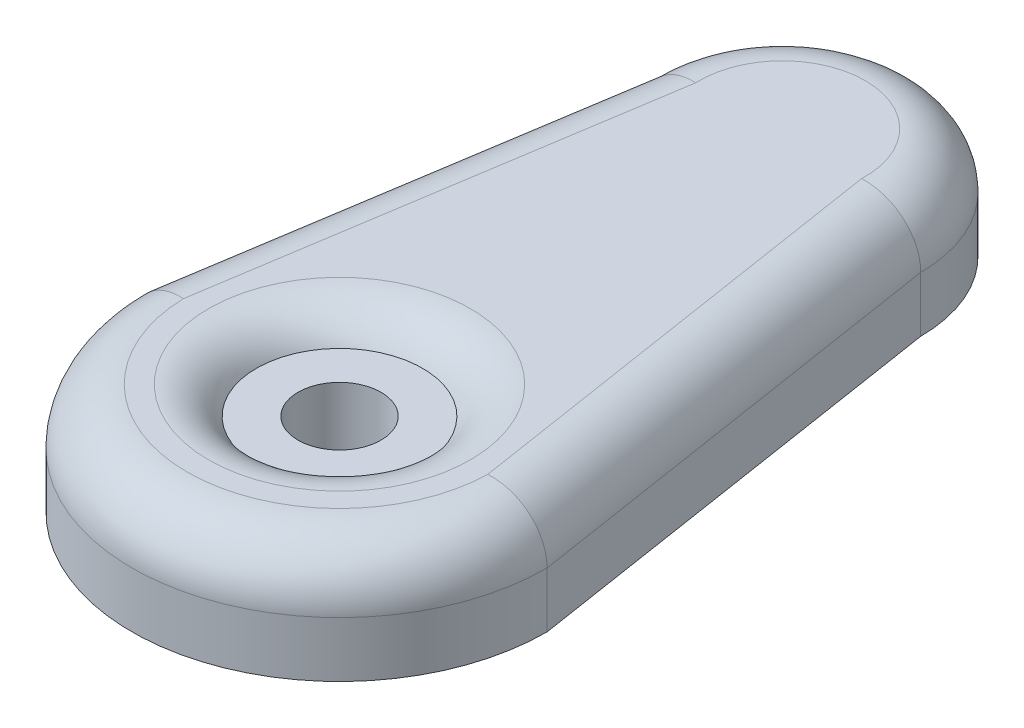
ISO-10303-21;
HEADER;
FILE_DESCRIPTION(('STEP AP214'),'2;1');
FILE_NAME('part.step','',(''),(''),'','','');
FILE_SCHEMA(('AUTOMOTIVE_DESIGN { 1 0 10303 214 1 1 1 1 }'));
ENDSEC;
DATA;
#1=APPLICATION_CONTEXT('core data for automotive mechanical design processes');
#2=APPLICATION_PROTOCOL_DEFINITION('international standard','automotive_design',2000,#1);
#3=PRODUCT_CONTEXT('',#1,'mechanical');
#4=PRODUCT('Part','Part','',(#3));
#5=PRODUCT_RELATED_PRODUCT_CATEGORY('part','',(#4));
#6=PRODUCT_DEFINITION_FORMATION('','',#4);
#7=PRODUCT_DEFINITION_CONTEXT('part definition',#1,'design');
#8=PRODUCT_DEFINITION('design','',#6,#7);
#9=PRODUCT_DEFINITION_SHAPE('','',#8);
#10=(LENGTH_UNIT() NAMED_UNIT(*) SI_UNIT(.MILLI.,.METRE.));
#11=(NAMED_UNIT(*) PLANE_ANGLE_UNIT() SI_UNIT($,.RADIAN.));
#12=(NAMED_UNIT(*) SI_UNIT($,.STERADIAN.) SOLID_ANGLE_UNIT());
#13=UNCERTAINTY_MEASURE_WITH_UNIT(LENGTH_MEASURE(1.E-05),#10,'distance_accuracy_value','');
#14=(GEOMETRIC_REPRESENTATION_CONTEXT(3) GLOBAL_UNCERTAINTY_ASSIGNED_CONTEXT((#13)) GLOBAL_UNIT_ASSIGNED_CONTEXT((#10,
#11,#12)) REPRESENTATION_CONTEXT('',''));
#15=CARTESIAN_POINT('',(0.,0.,0.));
#16=DIRECTION('',(0.,0.,1.));
#17=DIRECTION('',(1.,0.,0.));
#18=AXIS2_PLACEMENT_3D('',#15,#16,#17);
#19=CARTESIAN_POINT('',(0.,2.,0.));
#20=DIRECTION('',(0.,-1.,0.));
#21=DIRECTION('',(0.,0.,-1.));
#22=AXIS2_PLACEMENT_3D('',#19,#20,#21);
#23=CYLINDRICAL_SURFACE('',#22,0.75);
#24=CARTESIAN_POINT('',(0.,0.,0.));
#25=DIRECTION('',(0.,1.,0.));
#26=DIRECTION('',(0.,0.,1.));
#27=AXIS2_PLACEMENT_3D('',#24,#25,#26);
#28=CIRCLE('',#27,0.75);
#29=CARTESIAN_POINT('',(0.,0.,0.75));
#30=VERTEX_POINT('',#29);
#31=EDGE_CURVE('E117',#30,#30,#28,.T.);
#32=ORIENTED_EDGE('',*,*,#31,.F.);
#33=EDGE_LOOP('',(#32));
#34=FACE_BOUND('',#33,.T.);
#35=CARTESIAN_POINT('',(0.,1.5,0.));
#36=DIRECTION('',(0.,1.,0.));
#37=DIRECTION('',(0.,0.,1.));
#38=AXIS2_PLACEMENT_3D('',#35,#36,#37);
#39=CIRCLE('',#38,0.75);
#40=CARTESIAN_POINT('',(0.,1.5,0.75));
#41=VERTEX_POINT('',#40);
#42=EDGE_CURVE('E120',#41,#41,#39,.T.);
#43=ORIENTED_EDGE('',*,*,#42,.T.);
#44=EDGE_LOOP('',(#43));
#45=FACE_BOUND('',#44,.T.);
#46=ADVANCED_FACE('F33',(#34,#45),#23,.F.);
#47=CARTESIAN_POINT('',(0.,2.,-8.));
#48=DIRECTION('',(0.,1.,0.));
#49=DIRECTION('',(0.,0.,1.));
#50=AXIS2_PLACEMENT_3D('',#47,#48,#49);
#51=PLANE('',#50);
#52=CARTESIAN_POINT('',(0.,2.,0.));
#53=DIRECTION('',(0.,1.,0.));
#54=DIRECTION('',(0.,0.,1.));
#55=AXIS2_PLACEMENT_3D('',#52,#53,#54);
#56=CIRCLE('',#55,2.36602540378444);
#57=CARTESIAN_POINT('',(0.,2.,2.36602540378444));
#58=VERTEX_POINT('',#57);
#59=EDGE_CURVE('E142',#58,#58,#56,.F.);
#60=ORIENTED_EDGE('',*,*,#59,.T.);
#61=EDGE_LOOP('',(#60));
#62=FACE_BOUND('',#61,.T.);
#63=DIRECTION('',(-0.15437688027361,0.,-0.988012033751101));
#64=VECTOR('',#63,1.);
#65=CARTESIAN_POINT('',(1.5119879662489,2.,-7.84562311972639));
#66=LINE('',#65,#64);
#67=CARTESIAN_POINT('',(2.74906578742303,2.,0.0716749357880239));
#68=VERTEX_POINT('',#67);
#69=CARTESIAN_POINT('',(1.49846545248846,2.,-7.93216720779323));
#70=VERTEX_POINT('',#69);
#71=EDGE_CURVE('E137',#68,#70,#66,.T.);
#72=ORIENTED_EDGE('',*,*,#71,.T.);
#73=CARTESIAN_POINT('',(0.,2.,-8.));
#74=DIRECTION('',(0.,1.,0.));
#75=DIRECTION('',(0.,0.,1.));
#76=AXIS2_PLACEMENT_3D('',#73,#74,#75);
#77=CIRCLE('',#76,1.5);
#78=CARTESIAN_POINT('',(-1.49846545248846,2.,-7.93216720779323));
#79=VERTEX_POINT('',#78);
#80=EDGE_CURVE('E139',#70,#79,#77,.T.);
#81=ORIENTED_EDGE('',*,*,#80,.T.);
#82=DIRECTION('',(-0.15437688027361,0.,0.988012033751101));
#83=VECTOR('',#82,1.);
#84=CARTESIAN_POINT('',(-2.7619879662489,2.,0.15437688027361));
#85=LINE('',#84,#83);
#86=CARTESIAN_POINT('',(-2.74906578742303,2.,0.0716749357880213));
#87=VERTEX_POINT('',#86);
#88=EDGE_CURVE('E102',#79,#87,#85,.T.);
#89=ORIENTED_EDGE('',*,*,#88,.T.);
#90=CARTESIAN_POINT('',(0.,2.,0.));
#91=DIRECTION('',(0.,1.,0.));
#92=DIRECTION('',(0.,0.,1.));
#93=AXIS2_PLACEMENT_3D('',#90,#91,#92);
#94=CIRCLE('',#93,2.75);
#95=EDGE_CURVE('E135',#87,#68,#94,.T.);
#96=ORIENTED_EDGE('',*,*,#95,.T.);
#97=EDGE_LOOP('',(#72,#81,#89,#96));
#98=FACE_BOUND('',#97,.T.);
#99=ADVANCED_FACE('F184',(#62,#98),#51,.T.);
#100=CARTESIAN_POINT('',(0.,0.,-8.));
#101=DIRECTION('',(0.,1.,0.));
#102=DIRECTION('',(0.,0.,1.));
#103=AXIS2_PLACEMENT_3D('',#100,#101,#102);
#104=PLANE('',#103);
#105=CARTESIAN_POINT('',(0.,0.,-8.));
#106=DIRECTION('',(0.,1.,0.));
#107=DIRECTION('',(0.,0.,1.));
#108=AXIS2_PLACEMENT_3D('',#105,#106,#107);
#109=CIRCLE('',#108,2.5);
#110=CARTESIAN_POINT('',(2.5,0.,-8.));
#111=VERTEX_POINT('',#110);
#112=CARTESIAN_POINT('',(-2.5,0.,-8.));
#113=VERTEX_POINT('',#112);
#114=EDGE_CURVE('E110',#111,#113,#109,.T.);
#115=ORIENTED_EDGE('',*,*,#114,.F.);
#116=DIRECTION('',(-0.15437688027361,0.,-0.988012033751101));
#117=VECTOR('',#116,1.);
#118=CARTESIAN_POINT('',(2.5,0.,-8.));
#119=LINE('',#118,#117);
#120=CARTESIAN_POINT('',(3.75,0.,0.));
#121=VERTEX_POINT('',#120);
#122=EDGE_CURVE('E125',#121,#111,#119,.T.);
#123=ORIENTED_EDGE('',*,*,#122,.F.);
#124=CARTESIAN_POINT('',(0.,0.,0.));
#125=DIRECTION('',(0.,1.,0.));
#126=DIRECTION('',(0.,0.,1.));
#127=AXIS2_PLACEMENT_3D('',#124,#125,#126);
#128=CIRCLE('',#127,3.75);
#129=CARTESIAN_POINT('',(-3.75,0.,0.));
#130=VERTEX_POINT('',#129);
#131=EDGE_CURVE('E112',#130,#121,#128,.T.);
#132=ORIENTED_EDGE('',*,*,#131,.F.);
#133=DIRECTION('',(-0.15437688027361,0.,0.988012033751101));
#134=VECTOR('',#133,1.);
#135=CARTESIAN_POINT('',(-3.75,0.,0.));
#136=LINE('',#135,#134);
#137=EDGE_CURVE('E95',#113,#130,#136,.T.);
#138=ORIENTED_EDGE('',*,*,#137,.F.);
#139=EDGE_LOOP('',(#115,#123,#132,#138));
#140=FACE_BOUND('',#139,.T.);
#141=ORIENTED_EDGE('',*,*,#31,.T.);
#142=EDGE_LOOP('',(#141));
#143=FACE_BOUND('',#142,.T.);
#144=ADVANCED_FACE('F107',(#140,#143),#104,.F.);
#145=CARTESIAN_POINT('',(0.,2.,-8.));
#146=DIRECTION('',(0.,-1.,0.));
#147=DIRECTION('',(0.,0.,-1.));
#148=AXIS2_PLACEMENT_3D('',#145,#146,#147);
#149=CYLINDRICAL_SURFACE('',#148,2.5);
#150=DIRECTION('',(0.,-1.,0.));
#151=VECTOR('',#150,1.);
#152=CARTESIAN_POINT('',(-2.5,2.,-8.));
#153=LINE('',#152,#151);
#154=CARTESIAN_POINT('',(-2.5,1.,-8.));
#155=VERTEX_POINT('',#154);
#156=EDGE_CURVE('E92',#155,#113,#153,.T.);
#157=ORIENTED_EDGE('',*,*,#156,.F.);
#158=CARTESIAN_POINT('',(0.,1.,-8.));
#159=DIRECTION('',(0.,1.,0.));
#160=DIRECTION('',(0.,0.,1.));
#161=AXIS2_PLACEMENT_3D('',#158,#159,#160);
#162=CIRCLE('',#161,2.5);
#163=CARTESIAN_POINT('',(2.5,1.,-8.));
#164=VERTEX_POINT('',#163);
#165=EDGE_CURVE('E145',#155,#164,#162,.F.);
#166=ORIENTED_EDGE('',*,*,#165,.T.);
#167=DIRECTION('',(0.,-1.,0.));
#168=VECTOR('',#167,1.);
#169=CARTESIAN_POINT('',(2.5,2.,-8.));
#170=LINE('',#169,#168);
#171=EDGE_CURVE('E115',#164,#111,#170,.T.);
#172=ORIENTED_EDGE('',*,*,#171,.T.);
#173=ORIENTED_EDGE('',*,*,#114,.T.);
#174=EDGE_LOOP('',(#157,#166,#172,#173));
#175=FACE_BOUND('',#174,.T.);
#176=ADVANCED_FACE('F114',(#175),#149,.T.);
#177=CARTESIAN_POINT('',(-3.75,2.,0.));
#178=DIRECTION('',(0.988012033751101,0.,0.15437688027361));
#179=DIRECTION('',(0.15437688027361,0.,-0.988012033751101));
#180=AXIS2_PLACEMENT_3D('',#177,#178,#179);
#181=PLANE('',#180);
#182=DIRECTION('',(0.,-1.,0.));
#183=VECTOR('',#182,1.);
#184=CARTESIAN_POINT('',(-3.75,2.,0.));
#185=LINE('',#184,#183);
#186=CARTESIAN_POINT('',(-3.75,1.,0.));
#187=VERTEX_POINT('',#186);
#188=EDGE_CURVE('E103',#187,#130,#185,.T.);
#189=ORIENTED_EDGE('',*,*,#188,.F.);
#190=DIRECTION('',(-0.15437688027361,0.,0.988012033751101));
#191=VECTOR('',#190,1.);
#192=CARTESIAN_POINT('',(-2.5,1.,-8.));
#193=LINE('',#192,#191);
#194=EDGE_CURVE('E11',#187,#155,#193,.F.);
#195=ORIENTED_EDGE('',*,*,#194,.T.);
#196=ORIENTED_EDGE('',*,*,#156,.T.);
#197=ORIENTED_EDGE('',*,*,#137,.T.);
#198=EDGE_LOOP('',(#189,#195,#196,#197));
#199=FACE_BOUND('',#198,.T.);
#200=ADVANCED_FACE('F94',(#199),#181,.F.);
#201=CARTESIAN_POINT('',(0.,2.,0.));
#202=DIRECTION('',(0.,-1.,0.));
#203=DIRECTION('',(0.,0.,-1.));
#204=AXIS2_PLACEMENT_3D('',#201,#202,#203);
#205=CYLINDRICAL_SURFACE('',#204,3.75);
#206=DIRECTION('',(0.,-1.,0.));
#207=VECTOR('',#206,1.);
#208=CARTESIAN_POINT('',(3.75,2.,0.));
#209=LINE('',#208,#207);
#210=CARTESIAN_POINT('',(3.75,1.,0.));
#211=VERTEX_POINT('',#210);
#212=EDGE_CURVE('E128',#211,#121,#209,.T.);
#213=ORIENTED_EDGE('',*,*,#212,.F.);
#214=CARTESIAN_POINT('',(0.,1.,0.));
#215=DIRECTION('',(0.,1.,0.));
#216=DIRECTION('',(0.,0.,1.));
#217=AXIS2_PLACEMENT_3D('',#214,#215,#216);
#218=CIRCLE('',#217,3.75);
#219=EDGE_CURVE('E47',#211,#187,#218,.F.);
#220=ORIENTED_EDGE('',*,*,#219,.T.);
#221=ORIENTED_EDGE('',*,*,#188,.T.);
#222=ORIENTED_EDGE('',*,*,#131,.T.);
#223=EDGE_LOOP('',(#213,#220,#221,#222));
#224=FACE_BOUND('',#223,.T.);
#225=ADVANCED_FACE('F202',(#224),#205,.T.);
#226=CARTESIAN_POINT('',(2.5,2.,-8.));
#227=DIRECTION('',(-0.988012033751101,0.,0.15437688027361));
#228=DIRECTION('',(0.15437688027361,0.,0.988012033751101));
#229=AXIS2_PLACEMENT_3D('',#226,#227,#228);
#230=PLANE('',#229);
#231=ORIENTED_EDGE('',*,*,#171,.F.);
#232=DIRECTION('',(-0.15437688027361,0.,-0.988012033751101));
#233=VECTOR('',#232,1.);
#234=CARTESIAN_POINT('',(3.75,1.,0.));
#235=LINE('',#234,#233);
#236=EDGE_CURVE('E62',#164,#211,#235,.F.);
#237=ORIENTED_EDGE('',*,*,#236,.T.);
#238=ORIENTED_EDGE('',*,*,#212,.T.);
#239=ORIENTED_EDGE('',*,*,#122,.T.);
#240=EDGE_LOOP('',(#231,#237,#238,#239));
#241=FACE_BOUND('',#240,.T.);
#242=ADVANCED_FACE('F199',(#241),#230,.F.);
#243=CARTESIAN_POINT('',(0.,1.5,0.));
#244=DIRECTION('',(0.,1.,0.));
#245=DIRECTION('',(0.,0.,1.));
#246=AXIS2_PLACEMENT_3D('',#243,#244,#245);
#247=PLANE('',#246);
#248=ORIENTED_EDGE('',*,*,#42,.F.);
#249=EDGE_LOOP('',(#248));
#250=FACE_BOUND('',#249,.T.);
#251=CARTESIAN_POINT('',(0.,1.5,0.));
#252=DIRECTION('',(0.,1.,0.));
#253=DIRECTION('',(0.,0.,1.));
#254=AXIS2_PLACEMENT_3D('',#251,#252,#253);
#255=CIRCLE('',#254,1.5);
#256=CARTESIAN_POINT('',(0.,1.5,1.5));
#257=VERTEX_POINT('',#256);
#258=EDGE_CURVE('E133',#257,#257,#255,.T.);
#259=ORIENTED_EDGE('',*,*,#258,.T.);
#260=EDGE_LOOP('',(#259));
#261=FACE_BOUND('',#260,.T.);
#262=ADVANCED_FACE('F195',(#250,#261),#247,.T.);
#263=CARTESIAN_POINT('',(0.,1.,0.));
#264=DIRECTION('',(0.,1.,0.));
#265=DIRECTION('',(0.,0.,1.));
#266=AXIS2_PLACEMENT_3D('',#263,#264,#265);
#267=TOROIDAL_SURFACE('',#266,2.36602540378444,1.);
#268=ORIENTED_EDGE('',*,*,#59,.F.);
#269=EDGE_LOOP('',(#268));
#270=FACE_BOUND('',#269,.T.);
#271=ORIENTED_EDGE('',*,*,#258,.F.);
#272=EDGE_LOOP('',(#271));
#273=FACE_BOUND('',#272,.T.);
#274=ADVANCED_FACE('F180',(#270,#273),#267,.T.);
#275=CARTESIAN_POINT('',(0.,1.,0.));
#276=DIRECTION('',(0.,1.,0.));
#277=DIRECTION('',(0.,0.,1.));
#278=AXIS2_PLACEMENT_3D('',#275,#276,#277);
#279=TOROIDAL_SURFACE('',#278,2.75,1.);
#280=CARTESIAN_POINT('',(-3.75,1.,0.));
#281=CARTESIAN_POINT('',(-3.74999984602064,1.0280699006242,-5.86924204721654E-08));
#282=CARTESIAN_POINT('',(-3.74881737641614,1.0561263341911,9.18432937635455E-05));
#283=CARTESIAN_POINT('',(-3.74410024991451,1.11203803233622,0.00045799994289921));
#284=CARTESIAN_POINT('',(-3.74056571792587,1.13989330751775,0.000732244922352711));
#285=CARTESIAN_POINT('',(-3.72646811670182,1.22280872157408,0.00182494612941895));
#286=CARTESIAN_POINT('',(-3.71241094663641,1.27731275118426,0.00291337980564811));
#287=CARTESIAN_POINT('',(-3.67537447407396,1.38317718367017,0.00576748260465847));
#288=CARTESIAN_POINT('',(-3.6523911505615,1.43453615768662,0.00753345693870114));
#289=CARTESIAN_POINT('',(-3.59816501947072,1.53265774298214,0.0116720625918962));
#290=CARTESIAN_POINT('',(-3.5669239851733,1.57942133813003,0.0140445636604372));
#291=CARTESIAN_POINT('',(-3.49703283062108,1.66709092696407,0.019305922065524));
#292=CARTESIAN_POINT('',(-3.45837415273462,1.70799005873578,0.0221953755401001));
#293=CARTESIAN_POINT('',(-3.37475620897103,1.78273608200765,0.0283773909095402));
#294=CARTESIAN_POINT('',(-3.32979483449606,1.81658060389079,0.0316700876646282));
#295=CARTESIAN_POINT('',(-3.23471489326697,1.87635162924102,0.0385421785033626));
#296=CARTESIAN_POINT('',(-3.18458064592949,1.90225305266343,0.0421224365482976));
#297=CARTESIAN_POINT('',(-3.08070676189316,1.94526178654891,0.0494254867575247));
#298=CARTESIAN_POINT('',(-3.0269701373089,1.96237634293948,0.0531481587516418));
#299=CARTESIAN_POINT('',(-2.93804284832229,1.98267289484684,0.0591986163642661));
#300=CARTESIAN_POINT('',(-2.903466369746,1.98867347532581,0.0615251995852129));
#301=CARTESIAN_POINT('',(-2.83390765179037,1.9970196628643,0.0661487754777545));
#302=CARTESIAN_POINT('',(-2.79892612741084,1.9993709419793,0.0684458085558588));
#303=CARTESIAN_POINT('',(-2.75898097086312,1.99996336214033,0.0710342585895969));
#304=CARTESIAN_POINT('',(-2.7540231206543,2.00000009697362,0.0713549208400898));
#305=CARTESIAN_POINT('',(-2.74906578742302,2.,0.0716749357880235));
#306=B_SPLINE_CURVE_WITH_KNOTS('',3,(#280,#281,#282,#283,#284,#285,#286,#287,#288,#289,#290,
#291,#292,#293,#294,#295,#296,#297,#298,#299,#300,#301,#302,#303,#304,#305),.UNSPECIFIED.,.F.,
.F.,(4,2,2,2,2,2,2,2,2,2,2,2,4),(0.,0.084157913465282,0.16831135800143,0.336338945664211,
0.504442313635744,0.672509611967554,0.840771985881419,1.00909078774085,1.17793570437343,
1.34664116162394,1.4519875388451,1.55717001318027,1.57207441079305),.UNSPECIFIED.);
#307=EDGE_CURVE('E219',#187,#87,#306,.T.);
#308=ORIENTED_EDGE('',*,*,#307,.F.);
#309=ORIENTED_EDGE('',*,*,#219,.F.);
#310=CARTESIAN_POINT('',(3.75,1.,0.));
#311=CARTESIAN_POINT('',(3.74999984602064,1.0280699006242,-5.86924205972815E-08));
#312=CARTESIAN_POINT('',(3.74881737641614,1.0561263341911,9.18432937631283E-05));
#313=CARTESIAN_POINT('',(3.74410024991451,1.11203803233622,0.000457999942898813));
#314=CARTESIAN_POINT('',(3.74056571792587,1.13989330751775,0.000732244922352626));
#315=CARTESIAN_POINT('',(3.72646811670182,1.22280872157408,0.00182494612942007));
#316=CARTESIAN_POINT('',(3.71241094663641,1.27731275118426,0.00291337980565041));
#317=CARTESIAN_POINT('',(3.67537447407396,1.38317718367017,0.00576748260466044));
#318=CARTESIAN_POINT('',(3.6523911505615,1.43453615768662,0.00753345693870162));
#319=CARTESIAN_POINT('',(3.59816501947072,1.53265774298214,0.011672062591896));
#320=CARTESIAN_POINT('',(3.5669239851733,1.57942133813003,0.0140445636604378));
#321=CARTESIAN_POINT('',(3.49703283062108,1.66709092696407,0.0193059220655245));
#322=CARTESIAN_POINT('',(3.45837415273462,1.70799005873578,0.0221953755400997));
#323=CARTESIAN_POINT('',(3.37475620897103,1.78273608200765,0.0283773909095384));
#324=CARTESIAN_POINT('',(3.32979483449606,1.81658060389079,0.0316700876646258));
#325=CARTESIAN_POINT('',(3.23471489326697,1.87635162924102,0.0385421785033618));
#326=CARTESIAN_POINT('',(3.18458064592949,1.90225305266343,0.0421224365482988));
#327=CARTESIAN_POINT('',(3.08070676189316,1.94526178654891,0.0494254867575237));
#328=CARTESIAN_POINT('',(3.0269701373089,1.96237634293948,0.0531481587516365));
#329=CARTESIAN_POINT('',(2.93804284832229,1.98267289484684,0.0591986163642671));
#330=CARTESIAN_POINT('',(2.903466369746,1.98867347532581,0.0615251995852194));
#331=CARTESIAN_POINT('',(2.83390765179037,1.9970196628643,0.0661487754777584));
#332=CARTESIAN_POINT('',(2.79892612741084,1.9993709419793,0.0684458085558545));
#333=CARTESIAN_POINT('',(2.75898097086311,1.99996336214033,0.0710342585895948));
#334=CARTESIAN_POINT('',(2.7540231206543,2.00000009697362,0.0713549208400882));
#335=CARTESIAN_POINT('',(2.74906578742302,2.,0.0716749357880226));
#336=B_SPLINE_CURVE_WITH_KNOTS('',3,(#310,#311,#312,#313,#314,#315,#316,#317,#318,#319,#320,
#321,#322,#323,#324,#325,#326,#327,#328,#329,#330,#331,#332,#333,#334,#335),.UNSPECIFIED.,.F.,
.F.,(4,2,2,2,2,2,2,2,2,2,2,2,4),(0.,0.084157913465282,0.16831135800143,0.33633894566421,
0.504442313635744,0.672509611967553,0.840771985881418,1.00909078774085,1.17793570437343,
1.34664116162394,1.4519875388451,1.55717001318027,1.57207441079305),.UNSPECIFIED.);
#337=EDGE_CURVE('E38',#68,#211,#336,.F.);
#338=ORIENTED_EDGE('',*,*,#337,.F.);
#339=ORIENTED_EDGE('',*,*,#95,.F.);
#340=EDGE_LOOP('',(#308,#309,#338,#339));
#341=FACE_BOUND('',#340,.T.);
#342=ADVANCED_FACE('F35',(#341),#279,.T.);
#343=CARTESIAN_POINT('',(1.45240741334137,1.,-8.22693865833459));
#344=DIRECTION('',(0.15437688027361,0.,0.988012033751101));
#345=DIRECTION('',(0.988012033751101,0.,-0.15437688027361));
#346=AXIS2_PLACEMENT_3D('',#343,#344,#345);
#347=CYLINDRICAL_SURFACE('',#346,1.);
#348=ORIENTED_EDGE('',*,*,#337,.T.);
#349=ORIENTED_EDGE('',*,*,#236,.F.);
#350=CARTESIAN_POINT('',(2.5,1.,-8.));
#351=CARTESIAN_POINT('',(2.49999984024675,1.02806855173232,-8.00000009342936));
#352=CARTESIAN_POINT('',(2.49881749054785,1.05612363842635,-7.99990816146001));
#353=CARTESIAN_POINT('',(2.49410080473513,1.11203268060346,-7.99954211259192));
#354=CARTESIAN_POINT('',(2.49056659263493,1.13988664661334,-7.99926800529927));
#355=CARTESIAN_POINT('',(2.476470138153,1.22279843151875,-7.99817641035704));
#356=CARTESIAN_POINT('',(2.46241398258961,1.2773002099411,-7.9970896366419));
#357=CARTESIAN_POINT('',(2.42537911268342,1.38316042091736,-7.99424679571478));
#358=CARTESIAN_POINT('',(2.40239636195738,1.43451741930144,-7.99249042573474));
#359=CARTESIAN_POINT('',(2.34816974164233,1.53263489584431,-7.98838930594893));
#360=CARTESIAN_POINT('',(2.31692765277036,1.57939636182449,-7.98604468297631));
#361=CARTESIAN_POINT('',(2.2470339668046,1.66705820464628,-7.98087194892716));
#362=CARTESIAN_POINT('',(2.20837430991496,1.7079521206507,-7.97804331229513));
#363=CARTESIAN_POINT('',(2.12475177163848,1.7826880190053,-7.97203412738261));
#364=CARTESIAN_POINT('',(2.07978681051567,1.81652766538661,-7.96885346306285));
#365=CARTESIAN_POINT('',(1.98469819580443,1.87628932047248,-7.96227916301633));
#366=CARTESIAN_POINT('',(1.93455907130766,1.90218660736895,-7.95888490116641));
#367=CARTESIAN_POINT('',(1.83067073886623,1.94519271727553,-7.95205259605027));
#368=CARTESIAN_POINT('',(1.77692448489469,1.96230863462661,-7.9486145904327));
#369=CARTESIAN_POINT('',(1.68778263731538,1.98265988244989,-7.9431159625246));
#370=CARTESIAN_POINT('',(1.65299878928532,1.98869025230019,-7.94101874968486));
#371=CARTESIAN_POINT('',(1.58301971964478,1.99705986687642,-7.93691018892797));
#372=CARTESIAN_POINT('',(1.5478252277414,1.99940487848271,-7.93489871165995));
#373=CARTESIAN_POINT('',(1.50790517149629,1.99996689122957,-7.93268689253063));
#374=CARTESIAN_POINT('',(1.50318508877185,2.00000008790126,-7.932426476111));
#375=CARTESIAN_POINT('',(1.49846545248846,2.,-7.93216720779323));
#376=B_SPLINE_CURVE_WITH_KNOTS('',3,(#350,#351,#352,#353,#354,#355,#356,#357,#358,#359,#360,
#361,#362,#363,#364,#365,#366,#367,#368,#369,#370,#371,#372,#373,#374,#375),.UNSPECIFIED.,.F.,
.F.,(4,2,2,2,2,2,2,2,2,2,2,2,4),(0.,0.084153873732034,0.168303310384154,0.336323561931253,
0.504419876652051,0.672479979246405,0.840723737805061,1.00902312084105,1.17784116561373,
1.34652260912361,1.45245011507809,1.55821169912571,1.57239328330756),.UNSPECIFIED.);
#377=EDGE_CURVE('E157',#70,#164,#376,.F.);
#378=ORIENTED_EDGE('',*,*,#377,.F.);
#379=ORIENTED_EDGE('',*,*,#71,.F.);
#380=EDGE_LOOP('',(#348,#349,#378,#379));
#381=FACE_BOUND('',#380,.T.);
#382=ADVANCED_FACE('F169',(#381),#347,.T.);
#383=CARTESIAN_POINT('',(-1.45240741334137,1.,-8.22693865833459));
#384=DIRECTION('',(0.15437688027361,0.,-0.988012033751101));
#385=DIRECTION('',(-0.988012033751101,0.,-0.15437688027361));
#386=AXIS2_PLACEMENT_3D('',#383,#384,#385);
#387=CYLINDRICAL_SURFACE('',#386,1.);
#388=ORIENTED_EDGE('',*,*,#307,.T.);
#389=ORIENTED_EDGE('',*,*,#88,.F.);
#390=CARTESIAN_POINT('',(-2.5,1.,-8.));
#391=CARTESIAN_POINT('',(-2.49999984024675,1.02806855173232,-8.00000009342937));
#392=CARTESIAN_POINT('',(-2.49881749054785,1.05612363842635,-7.99990816146001));
#393=CARTESIAN_POINT('',(-2.49410080473513,1.11203268060346,-7.99954211259191));
#394=CARTESIAN_POINT('',(-2.49056659263493,1.13988664661334,-7.99926800529926));
#395=CARTESIAN_POINT('',(-2.476470138153,1.22279843151875,-7.99817641035703));
#396=CARTESIAN_POINT('',(-2.46241398258961,1.2773002099411,-7.99708963664189));
#397=CARTESIAN_POINT('',(-2.42537911268342,1.38316042091736,-7.99424679571478));
#398=CARTESIAN_POINT('',(-2.40239636195738,1.43451741930144,-7.99249042573474));
#399=CARTESIAN_POINT('',(-2.34816974164233,1.53263489584431,-7.98838930594893));
#400=CARTESIAN_POINT('',(-2.31692765277036,1.57939636182449,-7.98604468297631));
#401=CARTESIAN_POINT('',(-2.2470339668046,1.66705820464629,-7.98087194892716));
#402=CARTESIAN_POINT('',(-2.20837430991496,1.7079521206507,-7.97804331229513));
#403=CARTESIAN_POINT('',(-2.12475177163848,1.7826880190053,-7.97203412738261));
#404=CARTESIAN_POINT('',(-2.07978681051567,1.81652766538661,-7.96885346306284));
#405=CARTESIAN_POINT('',(-1.98469819580443,1.87628932047248,-7.96227916301633));
#406=CARTESIAN_POINT('',(-1.93455907130766,1.90218660736895,-7.95888490116641));
#407=CARTESIAN_POINT('',(-1.83067073886623,1.94519271727553,-7.95205259605027));
#408=CARTESIAN_POINT('',(-1.77692448489469,1.96230863462661,-7.94861459043271));
#409=CARTESIAN_POINT('',(-1.68778263731538,1.98265988244989,-7.94311596252459));
#410=CARTESIAN_POINT('',(-1.65299878928532,1.98869025230019,-7.94101874968485));
#411=CARTESIAN_POINT('',(-1.58301971964478,1.99705986687642,-7.93691018892796));
#412=CARTESIAN_POINT('',(-1.5478252277414,1.99940487848271,-7.93489871165995));
#413=CARTESIAN_POINT('',(-1.50790517149629,1.99996689122957,-7.93268689253063));
#414=CARTESIAN_POINT('',(-1.50318508877185,2.00000008790126,-7.932426476111));
#415=CARTESIAN_POINT('',(-1.49846545248846,2.,-7.93216720779323));
#416=B_SPLINE_CURVE_WITH_KNOTS('',3,(#390,#391,#392,#393,#394,#395,#396,#397,#398,#399,#400,
#401,#402,#403,#404,#405,#406,#407,#408,#409,#410,#411,#412,#413,#414,#415),.UNSPECIFIED.,.F.,
.F.,(4,2,2,2,2,2,2,2,2,2,2,2,4),(0.,0.084153873732034,0.168303310384154,0.336323561931253,
0.504419876652051,0.672479979246406,0.840723737805061,1.00902312084105,1.17784116561373,
1.34652260912361,1.45245011507809,1.55821169912571,1.57239328330757),.UNSPECIFIED.);
#417=EDGE_CURVE('E149',#155,#79,#416,.T.);
#418=ORIENTED_EDGE('',*,*,#417,.F.);
#419=ORIENTED_EDGE('',*,*,#194,.F.);
#420=EDGE_LOOP('',(#388,#389,#418,#419));
#421=FACE_BOUND('',#420,.T.);
#422=ADVANCED_FACE('F162',(#421),#387,.T.);
#423=CARTESIAN_POINT('',(0.,1.,-8.));
#424=DIRECTION('',(0.,1.,0.));
#425=DIRECTION('',(0.,0.,1.));
#426=AXIS2_PLACEMENT_3D('',#423,#424,#425);
#427=TOROIDAL_SURFACE('',#426,1.5,1.);
#428=ORIENTED_EDGE('',*,*,#377,.T.);
#429=ORIENTED_EDGE('',*,*,#165,.F.);
#430=ORIENTED_EDGE('',*,*,#417,.T.);
#431=ORIENTED_EDGE('',*,*,#80,.F.);
#432=EDGE_LOOP('',(#428,#429,#430,#431));
#433=FACE_BOUND('',#432,.T.);
#434=ADVANCED_FACE('F165',(#433),#427,.T.);
#435=CLOSED_SHELL('',(#46,#99,#144,#176,#200,#225,#242,#262,#274,#342,#382,#422,#434));
#436=MANIFOLD_SOLID_BREP('B2',#435);
#437=ADVANCED_BREP_SHAPE_REPRESENTATION('',(#18,#436),#14);
#438=SHAPE_DEFINITION_REPRESENTATION(#9,#437);
ENDSEC;
END-ISO-10303-21;
